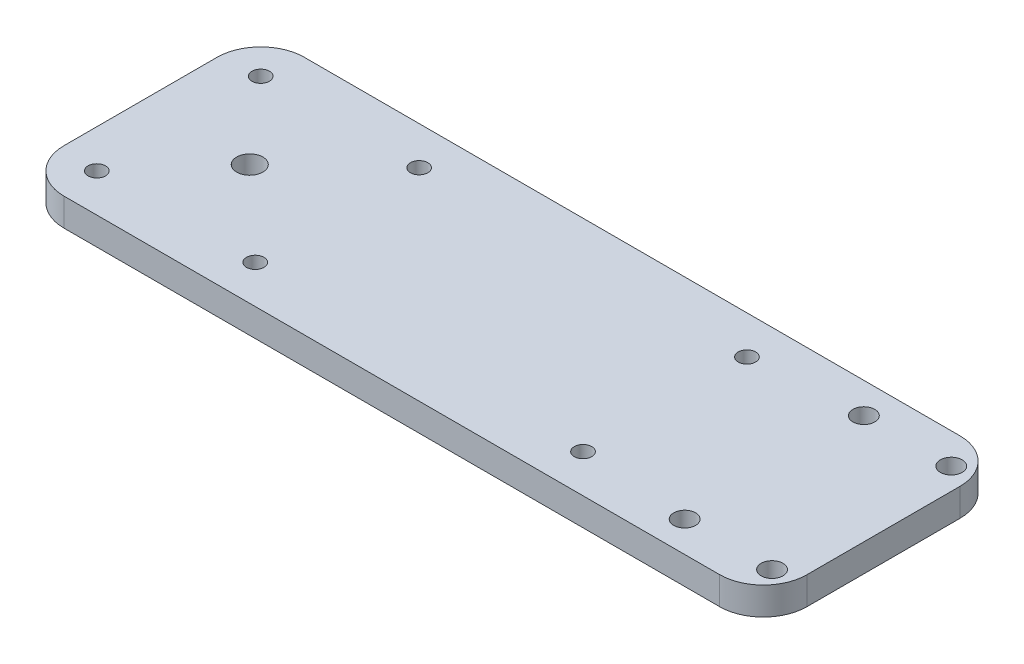
ISO-10303-21;
HEADER;
FILE_DESCRIPTION(('STEP AP214'),'2;1');
FILE_NAME('part.step','',(''),(''),'','','');
FILE_SCHEMA(('AUTOMOTIVE_DESIGN { 1 0 10303 214 1 1 1 1 }'));
ENDSEC;
DATA;
#1=APPLICATION_CONTEXT('core data for automotive mechanical design processes');
#2=APPLICATION_PROTOCOL_DEFINITION('international standard','automotive_design',2000,#1);
#3=PRODUCT_CONTEXT('',#1,'mechanical');
#4=PRODUCT('Part','Part','',(#3));
#5=PRODUCT_RELATED_PRODUCT_CATEGORY('part','',(#4));
#6=PRODUCT_DEFINITION_FORMATION('','',#4);
#7=PRODUCT_DEFINITION_CONTEXT('part definition',#1,'design');
#8=PRODUCT_DEFINITION('design','',#6,#7);
#9=PRODUCT_DEFINITION_SHAPE('','',#8);
#10=(LENGTH_UNIT() NAMED_UNIT(*) SI_UNIT(.MILLI.,.METRE.));
#11=(NAMED_UNIT(*) PLANE_ANGLE_UNIT() SI_UNIT($,.RADIAN.));
#12=(NAMED_UNIT(*) SI_UNIT($,.STERADIAN.) SOLID_ANGLE_UNIT());
#13=UNCERTAINTY_MEASURE_WITH_UNIT(LENGTH_MEASURE(1.E-05),#10,'distance_accuracy_value','');
#14=(GEOMETRIC_REPRESENTATION_CONTEXT(3) GLOBAL_UNCERTAINTY_ASSIGNED_CONTEXT((#13)) GLOBAL_UNIT_ASSIGNED_CONTEXT((#10,
#11,#12)) REPRESENTATION_CONTEXT('',''));
#15=CARTESIAN_POINT('',(0.,0.,0.));
#16=DIRECTION('',(0.,0.,1.));
#17=DIRECTION('',(1.,0.,0.));
#18=AXIS2_PLACEMENT_3D('',#15,#16,#17);
#19=CARTESIAN_POINT('',(-25.,6.35,-27.5));
#20=DIRECTION('',(1.,0.,0.));
#21=DIRECTION('',(0.,0.,-1.));
#22=AXIS2_PLACEMENT_3D('',#19,#20,#21);
#23=PLANE('',#22);
#24=DIRECTION('',(0.,0.,1.));
#25=VECTOR('',#24,1.);
#26=CARTESIAN_POINT('',(-25.,0.,-27.5));
#27=LINE('',#26,#25);
#28=CARTESIAN_POINT('',(-25.,0.,-17.5));
#29=VERTEX_POINT('',#28);
#30=CARTESIAN_POINT('',(-25.,0.,17.5));
#31=VERTEX_POINT('',#30);
#32=EDGE_CURVE('E136',#29,#31,#27,.T.);
#33=ORIENTED_EDGE('',*,*,#32,.T.);
#34=DIRECTION('',(0.,-1.,0.));
#35=VECTOR('',#34,1.);
#36=CARTESIAN_POINT('',(-25.,6.35,17.5));
#37=LINE('',#36,#35);
#38=CARTESIAN_POINT('',(-25.,6.35,17.5));
#39=VERTEX_POINT('',#38);
#40=EDGE_CURVE('E111',#31,#39,#37,.F.);
#41=ORIENTED_EDGE('',*,*,#40,.T.);
#42=DIRECTION('',(0.,0.,1.));
#43=VECTOR('',#42,1.);
#44=CARTESIAN_POINT('',(-25.,6.35,-27.5));
#45=LINE('',#44,#43);
#46=CARTESIAN_POINT('',(-25.,6.35,-17.5));
#47=VERTEX_POINT('',#46);
#48=EDGE_CURVE('E149',#47,#39,#45,.T.);
#49=ORIENTED_EDGE('',*,*,#48,.F.);
#50=DIRECTION('',(0.,-1.,0.));
#51=VECTOR('',#50,1.);
#52=CARTESIAN_POINT('',(-25.,6.35,-17.5));
#53=LINE('',#52,#51);
#54=EDGE_CURVE('E117',#47,#29,#53,.T.);
#55=ORIENTED_EDGE('',*,*,#54,.T.);
#56=EDGE_LOOP('',(#33,#41,#49,#55));
#57=FACE_BOUND('',#56,.T.);
#58=ADVANCED_FACE('F39',(#57),#23,.F.);
#59=CARTESIAN_POINT('',(-25.,6.35,27.5));
#60=DIRECTION('',(0.,0.,-1.));
#61=DIRECTION('',(-1.,0.,0.));
#62=AXIS2_PLACEMENT_3D('',#59,#60,#61);
#63=PLANE('',#62);
#64=DIRECTION('',(1.,0.,0.));
#65=VECTOR('',#64,1.);
#66=CARTESIAN_POINT('',(-25.,6.35,27.5));
#67=LINE('',#66,#65);
#68=CARTESIAN_POINT('',(-15.,6.35,27.5));
#69=VERTEX_POINT('',#68);
#70=CARTESIAN_POINT('',(135.,6.35,27.5));
#71=VERTEX_POINT('',#70);
#72=EDGE_CURVE('E127',#69,#71,#67,.T.);
#73=ORIENTED_EDGE('',*,*,#72,.F.);
#74=DIRECTION('',(0.,-1.,0.));
#75=VECTOR('',#74,1.);
#76=CARTESIAN_POINT('',(-15.,6.35,27.5));
#77=LINE('',#76,#75);
#78=CARTESIAN_POINT('',(-15.,0.,27.5));
#79=VERTEX_POINT('',#78);
#80=EDGE_CURVE('E110',#69,#79,#77,.T.);
#81=ORIENTED_EDGE('',*,*,#80,.T.);
#82=DIRECTION('',(1.,0.,0.));
#83=VECTOR('',#82,1.);
#84=CARTESIAN_POINT('',(-25.,0.,27.5));
#85=LINE('',#84,#83);
#86=CARTESIAN_POINT('',(135.,0.,27.5));
#87=VERTEX_POINT('',#86);
#88=EDGE_CURVE('E124',#79,#87,#85,.T.);
#89=ORIENTED_EDGE('',*,*,#88,.T.);
#90=DIRECTION('',(0.,-1.,0.));
#91=VECTOR('',#90,1.);
#92=CARTESIAN_POINT('',(135.,6.35,27.5));
#93=LINE('',#92,#91);
#94=EDGE_CURVE('E130',#87,#71,#93,.F.);
#95=ORIENTED_EDGE('',*,*,#94,.T.);
#96=EDGE_LOOP('',(#73,#81,#89,#95));
#97=FACE_BOUND('',#96,.T.);
#98=ADVANCED_FACE('F123',(#97),#63,.F.);
#99=CARTESIAN_POINT('',(145.,6.35,-27.5));
#100=DIRECTION('',(-1.,0.,0.));
#101=DIRECTION('',(0.,0.,1.));
#102=AXIS2_PLACEMENT_3D('',#99,#100,#101);
#103=PLANE('',#102);
#104=DIRECTION('',(0.,0.,-1.));
#105=VECTOR('',#104,1.);
#106=CARTESIAN_POINT('',(145.,0.,-27.5));
#107=LINE('',#106,#105);
#108=CARTESIAN_POINT('',(145.,0.,17.5));
#109=VERTEX_POINT('',#108);
#110=CARTESIAN_POINT('',(145.,0.,-17.5));
#111=VERTEX_POINT('',#110);
#112=EDGE_CURVE('E135',#109,#111,#107,.T.);
#113=ORIENTED_EDGE('',*,*,#112,.T.);
#114=DIRECTION('',(0.,-1.,0.));
#115=VECTOR('',#114,1.);
#116=CARTESIAN_POINT('',(145.,6.35,-17.5));
#117=LINE('',#116,#115);
#118=CARTESIAN_POINT('',(145.,6.35,-17.5));
#119=VERTEX_POINT('',#118);
#120=EDGE_CURVE('E11',#111,#119,#117,.F.);
#121=ORIENTED_EDGE('',*,*,#120,.T.);
#122=DIRECTION('',(0.,0.,-1.));
#123=VECTOR('',#122,1.);
#124=CARTESIAN_POINT('',(145.,6.35,-27.5));
#125=LINE('',#124,#123);
#126=CARTESIAN_POINT('',(145.,6.35,17.5));
#127=VERTEX_POINT('',#126);
#128=EDGE_CURVE('E188',#127,#119,#125,.T.);
#129=ORIENTED_EDGE('',*,*,#128,.F.);
#130=DIRECTION('',(0.,-1.,0.));
#131=VECTOR('',#130,1.);
#132=CARTESIAN_POINT('',(145.,6.35,17.5));
#133=LINE('',#132,#131);
#134=EDGE_CURVE('E48',#127,#109,#133,.T.);
#135=ORIENTED_EDGE('',*,*,#134,.T.);
#136=EDGE_LOOP('',(#113,#121,#129,#135));
#137=FACE_BOUND('',#136,.T.);
#138=ADVANCED_FACE('F186',(#137),#103,.F.);
#139=CARTESIAN_POINT('',(-25.,6.35,-27.5));
#140=DIRECTION('',(0.,0.,1.));
#141=DIRECTION('',(1.,0.,0.));
#142=AXIS2_PLACEMENT_3D('',#139,#140,#141);
#143=PLANE('',#142);
#144=DIRECTION('',(-1.,0.,0.));
#145=VECTOR('',#144,1.);
#146=CARTESIAN_POINT('',(-25.,0.,-27.5));
#147=LINE('',#146,#145);
#148=CARTESIAN_POINT('',(135.,0.,-27.5));
#149=VERTEX_POINT('',#148);
#150=CARTESIAN_POINT('',(-15.,0.,-27.5));
#151=VERTEX_POINT('',#150);
#152=EDGE_CURVE('E141',#149,#151,#147,.T.);
#153=ORIENTED_EDGE('',*,*,#152,.T.);
#154=DIRECTION('',(0.,-1.,0.));
#155=VECTOR('',#154,1.);
#156=CARTESIAN_POINT('',(-15.,6.35,-27.5));
#157=LINE('',#156,#155);
#158=CARTESIAN_POINT('',(-15.,6.35,-27.5));
#159=VERTEX_POINT('',#158);
#160=EDGE_CURVE('E55',#151,#159,#157,.F.);
#161=ORIENTED_EDGE('',*,*,#160,.T.);
#162=DIRECTION('',(-1.,0.,0.));
#163=VECTOR('',#162,1.);
#164=CARTESIAN_POINT('',(-25.,6.35,-27.5));
#165=LINE('',#164,#163);
#166=CARTESIAN_POINT('',(135.,6.35,-27.5));
#167=VERTEX_POINT('',#166);
#168=EDGE_CURVE('E151',#167,#159,#165,.T.);
#169=ORIENTED_EDGE('',*,*,#168,.F.);
#170=DIRECTION('',(0.,-1.,0.));
#171=VECTOR('',#170,1.);
#172=CARTESIAN_POINT('',(135.,6.35,-27.5));
#173=LINE('',#172,#171);
#174=EDGE_CURVE('E176',#167,#149,#173,.T.);
#175=ORIENTED_EDGE('',*,*,#174,.T.);
#176=EDGE_LOOP('',(#153,#161,#169,#175));
#177=FACE_BOUND('',#176,.T.);
#178=ADVANCED_FACE('F195',(#177),#143,.F.);
#179=CARTESIAN_POINT('',(0.,6.35,0.));
#180=DIRECTION('',(0.,1.,0.));
#181=DIRECTION('',(0.,0.,1.));
#182=AXIS2_PLACEMENT_3D('',#179,#180,#181);
#183=PLANE('',#182);
#184=CARTESIAN_POINT('',(140.,6.35,-20.5));
#185=DIRECTION('',(0.,1.,0.));
#186=DIRECTION('',(0.,0.,1.));
#187=AXIS2_PLACEMENT_3D('',#184,#185,#186);
#188=CIRCLE('',#187,2.5);
#189=CARTESIAN_POINT('',(140.,6.35,-18.));
#190=VERTEX_POINT('',#189);
#191=EDGE_CURVE('E289',#190,#190,#188,.T.);
#192=ORIENTED_EDGE('',*,*,#191,.F.);
#193=EDGE_LOOP('',(#192));
#194=FACE_BOUND('',#193,.T.);
#195=CARTESIAN_POINT('',(120.,6.35,-20.5));
#196=DIRECTION('',(0.,1.,0.));
#197=DIRECTION('',(0.,0.,1.));
#198=AXIS2_PLACEMENT_3D('',#195,#196,#197);
#199=CIRCLE('',#198,2.49999999999999);
#200=CARTESIAN_POINT('',(120.,6.35,-18.));
#201=VERTEX_POINT('',#200);
#202=EDGE_CURVE('E281',#201,#201,#199,.T.);
#203=ORIENTED_EDGE('',*,*,#202,.F.);
#204=EDGE_LOOP('',(#203));
#205=FACE_BOUND('',#204,.T.);
#206=CARTESIAN_POINT('',(140.,6.35,20.5));
#207=DIRECTION('',(0.,1.,0.));
#208=DIRECTION('',(0.,0.,1.));
#209=AXIS2_PLACEMENT_3D('',#206,#207,#208);
#210=CIRCLE('',#209,2.5);
#211=CARTESIAN_POINT('',(140.,6.35,23.));
#212=VERTEX_POINT('',#211);
#213=EDGE_CURVE('E273',#212,#212,#210,.T.);
#214=ORIENTED_EDGE('',*,*,#213,.F.);
#215=EDGE_LOOP('',(#214));
#216=FACE_BOUND('',#215,.T.);
#217=CARTESIAN_POINT('',(120.,6.35,20.5));
#218=DIRECTION('',(0.,1.,0.));
#219=DIRECTION('',(0.,0.,1.));
#220=AXIS2_PLACEMENT_3D('',#217,#218,#219);
#221=CIRCLE('',#220,2.49999999999999);
#222=CARTESIAN_POINT('',(120.,6.35,23.));
#223=VERTEX_POINT('',#222);
#224=EDGE_CURVE('E265',#223,#223,#221,.T.);
#225=ORIENTED_EDGE('',*,*,#224,.F.);
#226=EDGE_LOOP('',(#225));
#227=FACE_BOUND('',#226,.T.);
#228=CARTESIAN_POINT('',(-16.25,6.35,18.75));
#229=DIRECTION('',(0.,1.,0.));
#230=DIRECTION('',(0.,0.,1.));
#231=AXIS2_PLACEMENT_3D('',#228,#229,#230);
#232=CIRCLE('',#231,2.);
#233=CARTESIAN_POINT('',(-16.25,6.35,20.75));
#234=VERTEX_POINT('',#233);
#235=EDGE_CURVE('E257',#234,#234,#232,.T.);
#236=ORIENTED_EDGE('',*,*,#235,.F.);
#237=EDGE_LOOP('',(#236));
#238=FACE_BOUND('',#237,.T.);
#239=CARTESIAN_POINT('',(20.,6.35,18.75));
#240=DIRECTION('',(0.,1.,0.));
#241=DIRECTION('',(0.,0.,1.));
#242=AXIS2_PLACEMENT_3D('',#239,#240,#241);
#243=CIRCLE('',#242,2.);
#244=CARTESIAN_POINT('',(20.,6.35,20.75));
#245=VERTEX_POINT('',#244);
#246=EDGE_CURVE('E249',#245,#245,#243,.T.);
#247=ORIENTED_EDGE('',*,*,#246,.F.);
#248=EDGE_LOOP('',(#247));
#249=FACE_BOUND('',#248,.T.);
#250=CARTESIAN_POINT('',(95.,6.35,18.75));
#251=DIRECTION('',(0.,1.,0.));
#252=DIRECTION('',(0.,0.,1.));
#253=AXIS2_PLACEMENT_3D('',#250,#251,#252);
#254=CIRCLE('',#253,2.);
#255=CARTESIAN_POINT('',(95.,6.35,20.75));
#256=VERTEX_POINT('',#255);
#257=EDGE_CURVE('E241',#256,#256,#254,.T.);
#258=ORIENTED_EDGE('',*,*,#257,.F.);
#259=EDGE_LOOP('',(#258));
#260=FACE_BOUND('',#259,.T.);
#261=CARTESIAN_POINT('',(95.,6.35,-18.75));
#262=DIRECTION('',(0.,1.,0.));
#263=DIRECTION('',(0.,0.,1.));
#264=AXIS2_PLACEMENT_3D('',#261,#262,#263);
#265=CIRCLE('',#264,2.);
#266=CARTESIAN_POINT('',(95.,6.35,-16.75));
#267=VERTEX_POINT('',#266);
#268=EDGE_CURVE('E233',#267,#267,#265,.T.);
#269=ORIENTED_EDGE('',*,*,#268,.F.);
#270=EDGE_LOOP('',(#269));
#271=FACE_BOUND('',#270,.T.);
#272=CARTESIAN_POINT('',(20.,6.35,-18.75));
#273=DIRECTION('',(0.,1.,0.));
#274=DIRECTION('',(0.,0.,1.));
#275=AXIS2_PLACEMENT_3D('',#272,#273,#274);
#276=CIRCLE('',#275,2.);
#277=CARTESIAN_POINT('',(20.,6.35,-16.75));
#278=VERTEX_POINT('',#277);
#279=EDGE_CURVE('E225',#278,#278,#276,.T.);
#280=ORIENTED_EDGE('',*,*,#279,.F.);
#281=EDGE_LOOP('',(#280));
#282=FACE_BOUND('',#281,.T.);
#283=CARTESIAN_POINT('',(-16.25,6.35,-18.75));
#284=DIRECTION('',(0.,1.,0.));
#285=DIRECTION('',(0.,0.,1.));
#286=AXIS2_PLACEMENT_3D('',#283,#284,#285);
#287=CIRCLE('',#286,2.);
#288=CARTESIAN_POINT('',(-16.25,6.35,-16.75));
#289=VERTEX_POINT('',#288);
#290=EDGE_CURVE('E217',#289,#289,#287,.T.);
#291=ORIENTED_EDGE('',*,*,#290,.F.);
#292=EDGE_LOOP('',(#291));
#293=FACE_BOUND('',#292,.T.);
#294=CARTESIAN_POINT('',(0.,6.35,0.));
#295=DIRECTION('',(0.,1.,0.));
#296=DIRECTION('',(0.,0.,1.));
#297=AXIS2_PLACEMENT_3D('',#294,#295,#296);
#298=CIRCLE('',#297,3.);
#299=CARTESIAN_POINT('',(0.,6.35,3.));
#300=VERTEX_POINT('',#299);
#301=EDGE_CURVE('E209',#300,#300,#298,.T.);
#302=ORIENTED_EDGE('',*,*,#301,.F.);
#303=EDGE_LOOP('',(#302));
#304=FACE_BOUND('',#303,.T.);
#305=ORIENTED_EDGE('',*,*,#48,.T.);
#306=CARTESIAN_POINT('',(-15.,6.35,17.5));
#307=DIRECTION('',(0.,1.,0.));
#308=DIRECTION('',(0.,0.,1.));
#309=AXIS2_PLACEMENT_3D('',#306,#307,#308);
#310=CIRCLE('',#309,10.);
#311=EDGE_CURVE('E173',#39,#69,#310,.T.);
#312=ORIENTED_EDGE('',*,*,#311,.T.);
#313=ORIENTED_EDGE('',*,*,#72,.T.);
#314=CARTESIAN_POINT('',(135.,6.35,17.5));
#315=DIRECTION('',(0.,1.,0.));
#316=DIRECTION('',(0.,0.,1.));
#317=AXIS2_PLACEMENT_3D('',#314,#315,#316);
#318=CIRCLE('',#317,10.);
#319=EDGE_CURVE('E165',#71,#127,#318,.T.);
#320=ORIENTED_EDGE('',*,*,#319,.T.);
#321=ORIENTED_EDGE('',*,*,#128,.T.);
#322=CARTESIAN_POINT('',(135.,6.35,-17.5));
#323=DIRECTION('',(0.,1.,0.));
#324=DIRECTION('',(0.,0.,1.));
#325=AXIS2_PLACEMENT_3D('',#322,#323,#324);
#326=CIRCLE('',#325,10.);
#327=EDGE_CURVE('E62',#119,#167,#326,.T.);
#328=ORIENTED_EDGE('',*,*,#327,.T.);
#329=ORIENTED_EDGE('',*,*,#168,.T.);
#330=CARTESIAN_POINT('',(-15.,6.35,-17.5));
#331=DIRECTION('',(0.,1.,0.));
#332=DIRECTION('',(0.,0.,1.));
#333=AXIS2_PLACEMENT_3D('',#330,#331,#332);
#334=CIRCLE('',#333,10.);
#335=EDGE_CURVE('E170',#159,#47,#334,.T.);
#336=ORIENTED_EDGE('',*,*,#335,.T.);
#337=EDGE_LOOP('',(#305,#312,#313,#320,#321,#328,#329,#336));
#338=FACE_BOUND('',#337,.T.);
#339=ADVANCED_FACE('F296',(#194,#205,#216,#227,#238,#249,#260,#271,#282,#293,#304,#338),#183,.T.);
#340=CARTESIAN_POINT('',(0.,0.,0.));
#341=DIRECTION('',(0.,1.,0.));
#342=DIRECTION('',(0.,0.,1.));
#343=AXIS2_PLACEMENT_3D('',#340,#341,#342);
#344=PLANE('',#343);
#345=CARTESIAN_POINT('',(140.,0.,-20.5));
#346=DIRECTION('',(0.,1.,0.));
#347=DIRECTION('',(0.,0.,1.));
#348=AXIS2_PLACEMENT_3D('',#345,#346,#347);
#349=CIRCLE('',#348,2.5);
#350=CARTESIAN_POINT('',(140.,0.,-18.));
#351=VERTEX_POINT('',#350);
#352=EDGE_CURVE('E285',#351,#351,#349,.T.);
#353=ORIENTED_EDGE('',*,*,#352,.T.);
#354=EDGE_LOOP('',(#353));
#355=FACE_BOUND('',#354,.T.);
#356=CARTESIAN_POINT('',(120.,0.,-20.5));
#357=DIRECTION('',(0.,1.,0.));
#358=DIRECTION('',(0.,0.,1.));
#359=AXIS2_PLACEMENT_3D('',#356,#357,#358);
#360=CIRCLE('',#359,2.5);
#361=CARTESIAN_POINT('',(120.,0.,-18.));
#362=VERTEX_POINT('',#361);
#363=EDGE_CURVE('E277',#362,#362,#360,.T.);
#364=ORIENTED_EDGE('',*,*,#363,.T.);
#365=EDGE_LOOP('',(#364));
#366=FACE_BOUND('',#365,.T.);
#367=CARTESIAN_POINT('',(140.,0.,20.5));
#368=DIRECTION('',(0.,1.,0.));
#369=DIRECTION('',(0.,0.,1.));
#370=AXIS2_PLACEMENT_3D('',#367,#368,#369);
#371=CIRCLE('',#370,2.5);
#372=CARTESIAN_POINT('',(140.,0.,23.));
#373=VERTEX_POINT('',#372);
#374=EDGE_CURVE('E269',#373,#373,#371,.T.);
#375=ORIENTED_EDGE('',*,*,#374,.T.);
#376=EDGE_LOOP('',(#375));
#377=FACE_BOUND('',#376,.T.);
#378=CARTESIAN_POINT('',(120.,0.,20.5));
#379=DIRECTION('',(0.,1.,0.));
#380=DIRECTION('',(0.,0.,1.));
#381=AXIS2_PLACEMENT_3D('',#378,#379,#380);
#382=CIRCLE('',#381,2.5);
#383=CARTESIAN_POINT('',(120.,0.,23.));
#384=VERTEX_POINT('',#383);
#385=EDGE_CURVE('E261',#384,#384,#382,.T.);
#386=ORIENTED_EDGE('',*,*,#385,.T.);
#387=EDGE_LOOP('',(#386));
#388=FACE_BOUND('',#387,.T.);
#389=CARTESIAN_POINT('',(-16.25,0.,18.75));
#390=DIRECTION('',(0.,1.,0.));
#391=DIRECTION('',(0.,0.,1.));
#392=AXIS2_PLACEMENT_3D('',#389,#390,#391);
#393=CIRCLE('',#392,2.);
#394=CARTESIAN_POINT('',(-16.25,0.,20.75));
#395=VERTEX_POINT('',#394);
#396=EDGE_CURVE('E253',#395,#395,#393,.T.);
#397=ORIENTED_EDGE('',*,*,#396,.T.);
#398=EDGE_LOOP('',(#397));
#399=FACE_BOUND('',#398,.T.);
#400=CARTESIAN_POINT('',(20.,0.,18.75));
#401=DIRECTION('',(0.,1.,0.));
#402=DIRECTION('',(0.,0.,1.));
#403=AXIS2_PLACEMENT_3D('',#400,#401,#402);
#404=CIRCLE('',#403,2.);
#405=CARTESIAN_POINT('',(20.,0.,20.75));
#406=VERTEX_POINT('',#405);
#407=EDGE_CURVE('E245',#406,#406,#404,.T.);
#408=ORIENTED_EDGE('',*,*,#407,.T.);
#409=EDGE_LOOP('',(#408));
#410=FACE_BOUND('',#409,.T.);
#411=CARTESIAN_POINT('',(95.,0.,18.75));
#412=DIRECTION('',(0.,1.,0.));
#413=DIRECTION('',(0.,0.,1.));
#414=AXIS2_PLACEMENT_3D('',#411,#412,#413);
#415=CIRCLE('',#414,2.);
#416=CARTESIAN_POINT('',(95.,0.,20.75));
#417=VERTEX_POINT('',#416);
#418=EDGE_CURVE('E237',#417,#417,#415,.T.);
#419=ORIENTED_EDGE('',*,*,#418,.T.);
#420=EDGE_LOOP('',(#419));
#421=FACE_BOUND('',#420,.T.);
#422=CARTESIAN_POINT('',(95.,0.,-18.75));
#423=DIRECTION('',(0.,1.,0.));
#424=DIRECTION('',(0.,0.,1.));
#425=AXIS2_PLACEMENT_3D('',#422,#423,#424);
#426=CIRCLE('',#425,2.);
#427=CARTESIAN_POINT('',(95.,0.,-16.75));
#428=VERTEX_POINT('',#427);
#429=EDGE_CURVE('E229',#428,#428,#426,.T.);
#430=ORIENTED_EDGE('',*,*,#429,.T.);
#431=EDGE_LOOP('',(#430));
#432=FACE_BOUND('',#431,.T.);
#433=CARTESIAN_POINT('',(20.,0.,-18.75));
#434=DIRECTION('',(0.,1.,0.));
#435=DIRECTION('',(0.,0.,1.));
#436=AXIS2_PLACEMENT_3D('',#433,#434,#435);
#437=CIRCLE('',#436,2.);
#438=CARTESIAN_POINT('',(20.,0.,-16.75));
#439=VERTEX_POINT('',#438);
#440=EDGE_CURVE('E221',#439,#439,#437,.T.);
#441=ORIENTED_EDGE('',*,*,#440,.T.);
#442=EDGE_LOOP('',(#441));
#443=FACE_BOUND('',#442,.T.);
#444=CARTESIAN_POINT('',(-16.25,0.,-18.75));
#445=DIRECTION('',(0.,1.,0.));
#446=DIRECTION('',(0.,0.,1.));
#447=AXIS2_PLACEMENT_3D('',#444,#445,#446);
#448=CIRCLE('',#447,2.);
#449=CARTESIAN_POINT('',(-16.25,0.,-16.75));
#450=VERTEX_POINT('',#449);
#451=EDGE_CURVE('E213',#450,#450,#448,.T.);
#452=ORIENTED_EDGE('',*,*,#451,.T.);
#453=EDGE_LOOP('',(#452));
#454=FACE_BOUND('',#453,.T.);
#455=CARTESIAN_POINT('',(0.,0.,0.));
#456=DIRECTION('',(0.,1.,0.));
#457=DIRECTION('',(0.,0.,1.));
#458=AXIS2_PLACEMENT_3D('',#455,#456,#457);
#459=CIRCLE('',#458,3.);
#460=CARTESIAN_POINT('',(0.,0.,3.));
#461=VERTEX_POINT('',#460);
#462=EDGE_CURVE('E143',#461,#461,#459,.T.);
#463=ORIENTED_EDGE('',*,*,#462,.T.);
#464=EDGE_LOOP('',(#463));
#465=FACE_BOUND('',#464,.T.);
#466=ORIENTED_EDGE('',*,*,#88,.F.);
#467=CARTESIAN_POINT('',(-15.,0.,17.5));
#468=DIRECTION('',(0.,1.,0.));
#469=DIRECTION('',(0.,0.,1.));
#470=AXIS2_PLACEMENT_3D('',#467,#468,#469);
#471=CIRCLE('',#470,10.);
#472=EDGE_CURVE('E106',#79,#31,#471,.F.);
#473=ORIENTED_EDGE('',*,*,#472,.T.);
#474=ORIENTED_EDGE('',*,*,#32,.F.);
#475=CARTESIAN_POINT('',(-15.,0.,-17.5));
#476=DIRECTION('',(0.,1.,0.));
#477=DIRECTION('',(0.,0.,1.));
#478=AXIS2_PLACEMENT_3D('',#475,#476,#477);
#479=CIRCLE('',#478,10.);
#480=EDGE_CURVE('E118',#29,#151,#479,.F.);
#481=ORIENTED_EDGE('',*,*,#480,.T.);
#482=ORIENTED_EDGE('',*,*,#152,.F.);
#483=CARTESIAN_POINT('',(135.,0.,-17.5));
#484=DIRECTION('',(0.,1.,0.));
#485=DIRECTION('',(0.,0.,1.));
#486=AXIS2_PLACEMENT_3D('',#483,#484,#485);
#487=CIRCLE('',#486,10.);
#488=EDGE_CURVE('E155',#149,#111,#487,.F.);
#489=ORIENTED_EDGE('',*,*,#488,.T.);
#490=ORIENTED_EDGE('',*,*,#112,.F.);
#491=CARTESIAN_POINT('',(135.,0.,17.5));
#492=DIRECTION('',(0.,1.,0.));
#493=DIRECTION('',(0.,0.,1.));
#494=AXIS2_PLACEMENT_3D('',#491,#492,#493);
#495=CIRCLE('',#494,10.);
#496=EDGE_CURVE('E129',#109,#87,#495,.F.);
#497=ORIENTED_EDGE('',*,*,#496,.T.);
#498=EDGE_LOOP('',(#466,#473,#474,#481,#482,#489,#490,#497));
#499=FACE_BOUND('',#498,.T.);
#500=ADVANCED_FACE('F132',(#355,#366,#377,#388,#399,#410,#421,#432,#443,#454,#465,#499),#344,.F.);
#501=CARTESIAN_POINT('',(-15.,6.35,17.5));
#502=DIRECTION('',(0.,-1.,0.));
#503=DIRECTION('',(0.,0.,-1.));
#504=AXIS2_PLACEMENT_3D('',#501,#502,#503);
#505=CYLINDRICAL_SURFACE('',#504,10.);
#506=ORIENTED_EDGE('',*,*,#311,.F.);
#507=ORIENTED_EDGE('',*,*,#40,.F.);
#508=ORIENTED_EDGE('',*,*,#472,.F.);
#509=ORIENTED_EDGE('',*,*,#80,.F.);
#510=EDGE_LOOP('',(#506,#507,#508,#509));
#511=FACE_BOUND('',#510,.T.);
#512=ADVANCED_FACE('F109',(#511),#505,.T.);
#513=CARTESIAN_POINT('',(-15.,6.35,-17.5));
#514=DIRECTION('',(0.,-1.,0.));
#515=DIRECTION('',(0.,0.,-1.));
#516=AXIS2_PLACEMENT_3D('',#513,#514,#515);
#517=CYLINDRICAL_SURFACE('',#516,10.);
#518=ORIENTED_EDGE('',*,*,#335,.F.);
#519=ORIENTED_EDGE('',*,*,#160,.F.);
#520=ORIENTED_EDGE('',*,*,#480,.F.);
#521=ORIENTED_EDGE('',*,*,#54,.F.);
#522=EDGE_LOOP('',(#518,#519,#520,#521));
#523=FACE_BOUND('',#522,.T.);
#524=ADVANCED_FACE('F323',(#523),#517,.T.);
#525=CARTESIAN_POINT('',(135.,6.35,-17.5));
#526=DIRECTION('',(0.,-1.,0.));
#527=DIRECTION('',(0.,0.,-1.));
#528=AXIS2_PLACEMENT_3D('',#525,#526,#527);
#529=CYLINDRICAL_SURFACE('',#528,10.);
#530=ORIENTED_EDGE('',*,*,#327,.F.);
#531=ORIENTED_EDGE('',*,*,#120,.F.);
#532=ORIENTED_EDGE('',*,*,#488,.F.);
#533=ORIENTED_EDGE('',*,*,#174,.F.);
#534=EDGE_LOOP('',(#530,#531,#532,#533));
#535=FACE_BOUND('',#534,.T.);
#536=ADVANCED_FACE('F194',(#535),#529,.T.);
#537=CARTESIAN_POINT('',(135.,6.35,17.5));
#538=DIRECTION('',(0.,-1.,0.));
#539=DIRECTION('',(0.,0.,-1.));
#540=AXIS2_PLACEMENT_3D('',#537,#538,#539);
#541=CYLINDRICAL_SURFACE('',#540,10.);
#542=ORIENTED_EDGE('',*,*,#319,.F.);
#543=ORIENTED_EDGE('',*,*,#94,.F.);
#544=ORIENTED_EDGE('',*,*,#496,.F.);
#545=ORIENTED_EDGE('',*,*,#134,.F.);
#546=EDGE_LOOP('',(#542,#543,#544,#545));
#547=FACE_BOUND('',#546,.T.);
#548=ADVANCED_FACE('F41',(#547),#541,.T.);
#549=CARTESIAN_POINT('',(0.,6.35,0.));
#550=DIRECTION('',(0.,1.,0.));
#551=DIRECTION('',(0.,0.,1.));
#552=AXIS2_PLACEMENT_3D('',#549,#550,#551);
#553=CYLINDRICAL_SURFACE('',#552,3.);
#554=ORIENTED_EDGE('',*,*,#462,.F.);
#555=EDGE_LOOP('',(#554));
#556=FACE_BOUND('',#555,.T.);
#557=ORIENTED_EDGE('',*,*,#301,.T.);
#558=EDGE_LOOP('',(#557));
#559=FACE_BOUND('',#558,.T.);
#560=ADVANCED_FACE('F345',(#556,#559),#553,.F.);
#561=CARTESIAN_POINT('',(-16.25,6.35,-18.75));
#562=DIRECTION('',(0.,1.,0.));
#563=DIRECTION('',(0.,0.,1.));
#564=AXIS2_PLACEMENT_3D('',#561,#562,#563);
#565=CYLINDRICAL_SURFACE('',#564,2.);
#566=ORIENTED_EDGE('',*,*,#451,.F.);
#567=EDGE_LOOP('',(#566));
#568=FACE_BOUND('',#567,.T.);
#569=ORIENTED_EDGE('',*,*,#290,.T.);
#570=EDGE_LOOP('',(#569));
#571=FACE_BOUND('',#570,.T.);
#572=ADVANCED_FACE('F348',(#568,#571),#565,.F.);
#573=CARTESIAN_POINT('',(20.,6.35,-18.75));
#574=DIRECTION('',(0.,1.,0.));
#575=DIRECTION('',(0.,0.,1.));
#576=AXIS2_PLACEMENT_3D('',#573,#574,#575);
#577=CYLINDRICAL_SURFACE('',#576,2.);
#578=ORIENTED_EDGE('',*,*,#440,.F.);
#579=EDGE_LOOP('',(#578));
#580=FACE_BOUND('',#579,.T.);
#581=ORIENTED_EDGE('',*,*,#279,.T.);
#582=EDGE_LOOP('',(#581));
#583=FACE_BOUND('',#582,.T.);
#584=ADVANCED_FACE('F352',(#580,#583),#577,.F.);
#585=CARTESIAN_POINT('',(95.,6.35,-18.75));
#586=DIRECTION('',(0.,1.,0.));
#587=DIRECTION('',(0.,0.,1.));
#588=AXIS2_PLACEMENT_3D('',#585,#586,#587);
#589=CYLINDRICAL_SURFACE('',#588,2.);
#590=ORIENTED_EDGE('',*,*,#429,.F.);
#591=EDGE_LOOP('',(#590));
#592=FACE_BOUND('',#591,.T.);
#593=ORIENTED_EDGE('',*,*,#268,.T.);
#594=EDGE_LOOP('',(#593));
#595=FACE_BOUND('',#594,.T.);
#596=ADVANCED_FACE('F356',(#592,#595),#589,.F.);
#597=CARTESIAN_POINT('',(95.,6.35,18.75));
#598=DIRECTION('',(0.,1.,0.));
#599=DIRECTION('',(0.,0.,1.));
#600=AXIS2_PLACEMENT_3D('',#597,#598,#599);
#601=CYLINDRICAL_SURFACE('',#600,2.);
#602=ORIENTED_EDGE('',*,*,#418,.F.);
#603=EDGE_LOOP('',(#602));
#604=FACE_BOUND('',#603,.T.);
#605=ORIENTED_EDGE('',*,*,#257,.T.);
#606=EDGE_LOOP('',(#605));
#607=FACE_BOUND('',#606,.T.);
#608=ADVANCED_FACE('F360',(#604,#607),#601,.F.);
#609=CARTESIAN_POINT('',(20.,6.35,18.75));
#610=DIRECTION('',(0.,1.,0.));
#611=DIRECTION('',(0.,0.,1.));
#612=AXIS2_PLACEMENT_3D('',#609,#610,#611);
#613=CYLINDRICAL_SURFACE('',#612,2.);
#614=ORIENTED_EDGE('',*,*,#407,.F.);
#615=EDGE_LOOP('',(#614));
#616=FACE_BOUND('',#615,.T.);
#617=ORIENTED_EDGE('',*,*,#246,.T.);
#618=EDGE_LOOP('',(#617));
#619=FACE_BOUND('',#618,.T.);
#620=ADVANCED_FACE('F364',(#616,#619),#613,.F.);
#621=CARTESIAN_POINT('',(-16.25,6.35,18.75));
#622=DIRECTION('',(0.,1.,0.));
#623=DIRECTION('',(0.,0.,1.));
#624=AXIS2_PLACEMENT_3D('',#621,#622,#623);
#625=CYLINDRICAL_SURFACE('',#624,2.);
#626=ORIENTED_EDGE('',*,*,#396,.F.);
#627=EDGE_LOOP('',(#626));
#628=FACE_BOUND('',#627,.T.);
#629=ORIENTED_EDGE('',*,*,#235,.T.);
#630=EDGE_LOOP('',(#629));
#631=FACE_BOUND('',#630,.T.);
#632=ADVANCED_FACE('F368',(#628,#631),#625,.F.);
#633=CARTESIAN_POINT('',(120.,6.35,20.5));
#634=DIRECTION('',(0.,1.,0.));
#635=DIRECTION('',(0.,0.,1.));
#636=AXIS2_PLACEMENT_3D('',#633,#634,#635);
#637=CYLINDRICAL_SURFACE('',#636,2.5);
#638=ORIENTED_EDGE('',*,*,#385,.F.);
#639=EDGE_LOOP('',(#638));
#640=FACE_BOUND('',#639,.T.);
#641=ORIENTED_EDGE('',*,*,#224,.T.);
#642=EDGE_LOOP('',(#641));
#643=FACE_BOUND('',#642,.T.);
#644=ADVANCED_FACE('F372',(#640,#643),#637,.F.);
#645=CARTESIAN_POINT('',(140.,6.35,20.5));
#646=DIRECTION('',(0.,1.,0.));
#647=DIRECTION('',(0.,0.,1.));
#648=AXIS2_PLACEMENT_3D('',#645,#646,#647);
#649=CYLINDRICAL_SURFACE('',#648,2.5);
#650=ORIENTED_EDGE('',*,*,#374,.F.);
#651=EDGE_LOOP('',(#650));
#652=FACE_BOUND('',#651,.T.);
#653=ORIENTED_EDGE('',*,*,#213,.T.);
#654=EDGE_LOOP('',(#653));
#655=FACE_BOUND('',#654,.T.);
#656=ADVANCED_FACE('F376',(#652,#655),#649,.F.);
#657=CARTESIAN_POINT('',(120.,6.35,-20.5));
#658=DIRECTION('',(0.,1.,0.));
#659=DIRECTION('',(0.,0.,1.));
#660=AXIS2_PLACEMENT_3D('',#657,#658,#659);
#661=CYLINDRICAL_SURFACE('',#660,2.5);
#662=ORIENTED_EDGE('',*,*,#363,.F.);
#663=EDGE_LOOP('',(#662));
#664=FACE_BOUND('',#663,.T.);
#665=ORIENTED_EDGE('',*,*,#202,.T.);
#666=EDGE_LOOP('',(#665));
#667=FACE_BOUND('',#666,.T.);
#668=ADVANCED_FACE('F380',(#664,#667),#661,.F.);
#669=CARTESIAN_POINT('',(140.,6.35,-20.5));
#670=DIRECTION('',(0.,1.,0.));
#671=DIRECTION('',(0.,0.,1.));
#672=AXIS2_PLACEMENT_3D('',#669,#670,#671);
#673=CYLINDRICAL_SURFACE('',#672,2.5);
#674=ORIENTED_EDGE('',*,*,#352,.F.);
#675=EDGE_LOOP('',(#674));
#676=FACE_BOUND('',#675,.T.);
#677=ORIENTED_EDGE('',*,*,#191,.T.);
#678=EDGE_LOOP('',(#677));
#679=FACE_BOUND('',#678,.T.);
#680=ADVANCED_FACE('F294',(#676,#679),#673,.F.);
#681=CLOSED_SHELL('',(#58,#98,#138,#178,#339,#500,#512,#524,#536,#548,#560,#572,#584,#596,#608,
#620,#632,#644,#656,#668,#680));
#682=MANIFOLD_SOLID_BREP('B2',#681);
#683=ADVANCED_BREP_SHAPE_REPRESENTATION('',(#18,#682),#14);
#684=SHAPE_DEFINITION_REPRESENTATION(#9,#683);
ENDSEC;
END-ISO-10303-21;
